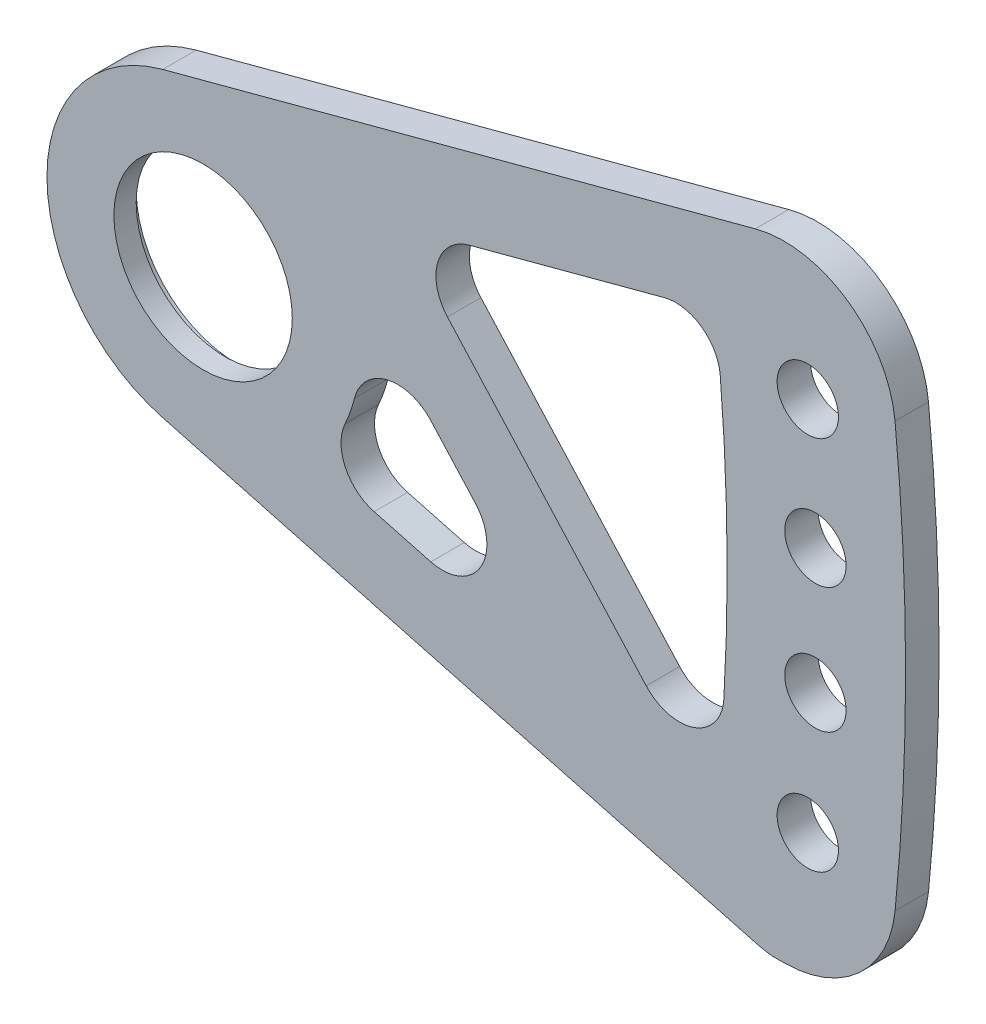
ISO-10303-21;
HEADER;
FILE_DESCRIPTION(('STEP AP214'),'2;1');
FILE_NAME('part.step','',(''),(''),'','','');
FILE_SCHEMA(('AUTOMOTIVE_DESIGN { 1 0 10303 214 1 1 1 1 }'));
ENDSEC;
DATA;
#1=APPLICATION_CONTEXT('core data for automotive mechanical design processes');
#2=APPLICATION_PROTOCOL_DEFINITION('international standard','automotive_design',2000,#1);
#3=PRODUCT_CONTEXT('',#1,'mechanical');
#4=PRODUCT('Part','Part','',(#3));
#5=PRODUCT_RELATED_PRODUCT_CATEGORY('part','',(#4));
#6=PRODUCT_DEFINITION_FORMATION('','',#4);
#7=PRODUCT_DEFINITION_CONTEXT('part definition',#1,'design');
#8=PRODUCT_DEFINITION('design','',#6,#7);
#9=PRODUCT_DEFINITION_SHAPE('','',#8);
#10=(LENGTH_UNIT() NAMED_UNIT(*) SI_UNIT(.MILLI.,.METRE.));
#11=(NAMED_UNIT(*) PLANE_ANGLE_UNIT() SI_UNIT($,.RADIAN.));
#12=(NAMED_UNIT(*) SI_UNIT($,.STERADIAN.) SOLID_ANGLE_UNIT());
#13=UNCERTAINTY_MEASURE_WITH_UNIT(LENGTH_MEASURE(1.E-05),#10,'distance_accuracy_value','');
#14=(GEOMETRIC_REPRESENTATION_CONTEXT(3) GLOBAL_UNCERTAINTY_ASSIGNED_CONTEXT((#13)) GLOBAL_UNIT_ASSIGNED_CONTEXT((#10,
#11,#12)) REPRESENTATION_CONTEXT('',''));
#15=CARTESIAN_POINT('',(0.,0.,0.));
#16=DIRECTION('',(0.,0.,1.));
#17=DIRECTION('',(1.,0.,0.));
#18=AXIS2_PLACEMENT_3D('',#15,#16,#17);
#19=CARTESIAN_POINT('',(129.,0.,3.));
#20=DIRECTION('',(0.,0.,-1.));
#21=DIRECTION('',(-1.,0.,0.));
#22=AXIS2_PLACEMENT_3D('',#19,#20,#21);
#23=CYLINDRICAL_SURFACE('',#22,8.00000000000001);
#24=CARTESIAN_POINT('',(129.,0.,3.));
#25=DIRECTION('',(0.,0.,1.));
#26=DIRECTION('',(1.,0.,0.));
#27=AXIS2_PLACEMENT_3D('',#24,#25,#26);
#28=CIRCLE('',#27,8.00000000000001);
#29=CARTESIAN_POINT('',(137.,0.,3.));
#30=VERTEX_POINT('',#29);
#31=EDGE_CURVE('E243',#30,#30,#28,.T.);
#32=ORIENTED_EDGE('',*,*,#31,.T.);
#33=EDGE_LOOP('',(#32));
#34=FACE_BOUND('',#33,.T.);
#35=CARTESIAN_POINT('',(129.,0.,1.));
#36=DIRECTION('',(0.,0.,-1.));
#37=DIRECTION('',(-1.,0.,0.));
#38=AXIS2_PLACEMENT_3D('',#35,#36,#37);
#39=CIRCLE('',#38,8.00000000000001);
#40=CARTESIAN_POINT('',(121.,0.,1.));
#41=VERTEX_POINT('',#40);
#42=EDGE_CURVE('E216',#41,#41,#39,.T.);
#43=ORIENTED_EDGE('',*,*,#42,.T.);
#44=EDGE_LOOP('',(#43));
#45=FACE_BOUND('',#44,.T.);
#46=ADVANCED_FACE('F36',(#34,#45),#23,.F.);
#47=CARTESIAN_POINT('',(129.,0.,3.));
#48=DIRECTION('',(0.,0.,1.));
#49=DIRECTION('',(1.,0.,0.));
#50=AXIS2_PLACEMENT_3D('',#47,#48,#49);
#51=PLANE('',#50);
#52=DIRECTION('',(-0.966145856932783,0.257996478913219,0.));
#53=VECTOR('',#52,1.);
#54=CARTESIAN_POINT('',(162.485080356981,-16.1870308877341,3.));
#55=LINE('',#54,#53);
#56=CARTESIAN_POINT('',(149.421967329904,-12.6986992445898,3.));
#57=VERTEX_POINT('',#56);
#58=CARTESIAN_POINT('',(144.341412562784,-11.3420042575576,3.));
#59=VERTEX_POINT('',#58);
#60=EDGE_CURVE('E362',#57,#59,#55,.T.);
#61=ORIENTED_EDGE('',*,*,#60,.T.);
#62=CARTESIAN_POINT('',(145.373398478437,-7.47742082982649,3.));
#63=DIRECTION('',(0.,0.,1.));
#64=DIRECTION('',(1.,0.,0.));
#65=AXIS2_PLACEMENT_3D('',#62,#63,#64);
#66=CIRCLE('',#65,4.);
#67=CARTESIAN_POINT('',(141.734865483229,-5.81577175653172,3.));
#68=VERTEX_POINT('',#67);
#69=EDGE_CURVE('E321',#59,#68,#66,.F.);
#70=ORIENTED_EDGE('',*,*,#69,.T.);
#71=CARTESIAN_POINT('',(129.,0.,3.));
#72=DIRECTION('',(0.,0.,1.));
#73=DIRECTION('',(-1.,0.,0.));
#74=AXIS2_PLACEMENT_3D('',#71,#72,#73);
#75=CIRCLE('',#74,14.);
#76=CARTESIAN_POINT('',(142.574461210024,-3.42549308239768,3.));
#77=VERTEX_POINT('',#76);
#78=EDGE_CURVE('E449',#68,#77,#75,.T.);
#79=ORIENTED_EDGE('',*,*,#78,.T.);
#80=CARTESIAN_POINT('',(146.452878698602,-4.40420539165416,3.));
#81=DIRECTION('',(0.,0.,1.));
#82=DIRECTION('',(1.,0.,0.));
#83=AXIS2_PLACEMENT_3D('',#80,#81,#82);
#84=CIRCLE('',#83,4.);
#85=CARTESIAN_POINT('',(149.421334223692,-1.72311013121173,3.));
#86=VERTEX_POINT('',#85);
#87=EDGE_CURVE('E317',#77,#86,#84,.F.);
#88=ORIENTED_EDGE('',*,*,#87,.T.);
#89=DIRECTION('',(0.670273815110609,-0.742113881272322,0.));
#90=VECTOR('',#89,1.);
#91=CARTESIAN_POINT('',(139.389594337812,9.38383341154853,3.));
#92=LINE('',#91,#90);
#93=CARTESIAN_POINT('',(153.422408770646,-6.15302055641629,3.));
#94=VERTEX_POINT('',#93);
#95=EDGE_CURVE('E442',#86,#94,#92,.T.);
#96=ORIENTED_EDGE('',*,*,#95,.T.);
#97=CARTESIAN_POINT('',(150.453953245557,-8.83411581685871,3.));
#98=DIRECTION('',(0.,0.,1.));
#99=DIRECTION('',(1.,0.,0.));
#100=AXIS2_PLACEMENT_3D('',#97,#98,#99);
#101=CIRCLE('',#100,4.);
#102=EDGE_CURVE('E325',#94,#57,#101,.F.);
#103=ORIENTED_EDGE('',*,*,#102,.T.);
#104=EDGE_LOOP('',(#61,#70,#79,#88,#96,#103));
#105=FACE_BOUND('',#104,.T.);
#106=DIRECTION('',(0.966145856932783,0.257996478913219,0.));
#107=VECTOR('',#106,1.);
#108=CARTESIAN_POINT('',(174.915688268969,19.5064604014363,3.));
#109=LINE('',#108,#107);
#110=CARTESIAN_POINT('',(152.849870212736,13.6140753935234,3.));
#111=VERTEX_POINT('',#110);
#112=CARTESIAN_POINT('',(170.361987818592,18.2904548948219,3.));
#113=VERTEX_POINT('',#112);
#114=EDGE_CURVE('E209',#111,#113,#109,.T.);
#115=ORIENTED_EDGE('',*,*,#114,.T.);
#116=CARTESIAN_POINT('',(171.393973734245,14.4258714670908,3.));
#117=DIRECTION('',(0.,0.,1.));
#118=DIRECTION('',(1.,0.,0.));
#119=AXIS2_PLACEMENT_3D('',#116,#117,#118);
#120=CIRCLE('',#119,4.);
#121=CARTESIAN_POINT('',(175.379880100157,14.7613568500464,3.));
#122=VERTEX_POINT('',#121);
#123=EDGE_CURVE('E11',#113,#122,#120,.F.);
#124=ORIENTED_EDGE('',*,*,#123,.T.);
#125=CARTESIAN_POINT('',(0.,0.,3.));
#126=DIRECTION('',(0.,0.,-1.));
#127=DIRECTION('',(-1.,0.,0.));
#128=AXIS2_PLACEMENT_3D('',#125,#126,#127);
#129=CIRCLE('',#128,176.);
#130=CARTESIAN_POINT('',(175.702937473933,-10.2214364465581,3.));
#131=VERTEX_POINT('',#130);
#132=EDGE_CURVE('E349',#122,#131,#129,.T.);
#133=ORIENTED_EDGE('',*,*,#132,.T.);
#134=CARTESIAN_POINT('',(171.70968889498,-9.98913107277269,3.));
#135=DIRECTION('',(0.,0.,1.));
#136=DIRECTION('',(1.,0.,0.));
#137=AXIS2_PLACEMENT_3D('',#134,#135,#136);
#138=CIRCLE('',#137,4.);
#139=CARTESIAN_POINT('',(168.741233369891,-12.6702263332151,3.));
#140=VERTEX_POINT('',#139);
#141=EDGE_CURVE('E333',#131,#140,#138,.F.);
#142=ORIENTED_EDGE('',*,*,#141,.T.);
#143=DIRECTION('',(-0.670273815110608,0.742113881272322,0.));
#144=VECTOR('',#143,1.);
#145=CARTESIAN_POINT('',(174.915688268969,-19.5064604014363,3.));
#146=LINE('',#145,#144);
#147=CARTESIAN_POINT('',(150.9134006033,7.06839670534984,3.));
#148=VERTEX_POINT('',#147);
#149=EDGE_CURVE('E353',#140,#148,#146,.T.);
#150=ORIENTED_EDGE('',*,*,#149,.T.);
#151=CARTESIAN_POINT('',(153.881856128389,9.74949196579227,3.));
#152=DIRECTION('',(0.,0.,1.));
#153=DIRECTION('',(1.,0.,0.));
#154=AXIS2_PLACEMENT_3D('',#151,#152,#153);
#155=CIRCLE('',#154,4.);
#156=EDGE_CURVE('E329',#148,#111,#155,.F.);
#157=ORIENTED_EDGE('',*,*,#156,.T.);
#158=EDGE_LOOP('',(#115,#124,#133,#142,#150,#157));
#159=FACE_BOUND('',#158,.T.);
#160=CARTESIAN_POINT('',(129.,0.,3.));
#161=DIRECTION('',(0.,0.,1.));
#162=DIRECTION('',(1.,0.,0.));
#163=AXIS2_PLACEMENT_3D('',#160,#161,#162);
#164=CIRCLE('',#163,14.);
#165=CARTESIAN_POINT('',(125.388049295215,13.526041997059,3.));
#166=VERTEX_POINT('',#165);
#167=CARTESIAN_POINT('',(125.388049295215,-13.526041997059,3.));
#168=VERTEX_POINT('',#167);
#169=EDGE_CURVE('E173',#166,#168,#164,.T.);
#170=ORIENTED_EDGE('',*,*,#169,.T.);
#171=DIRECTION('',(0.966145856932783,-0.257996478913219,0.));
#172=VECTOR('',#171,1.);
#173=CARTESIAN_POINT('',(178.522421186668,-27.7148735889893,3.));
#174=LINE('',#173,#172);
#175=CARTESIAN_POINT('',(178.522421186668,-27.7148735889893,3.));
#176=VERTEX_POINT('',#175);
#177=EDGE_CURVE('E179',#168,#176,#174,.T.);
#178=ORIENTED_EDGE('',*,*,#177,.T.);
#179=CARTESIAN_POINT('',(181.102385975801,-18.0534150196615,3.));
#180=DIRECTION('',(0.,0.,1.));
#181=DIRECTION('',(1.,0.,0.));
#182=AXIS2_PLACEMENT_3D('',#179,#180,#181);
#183=CIRCLE('',#182,10.);
#184=CARTESIAN_POINT('',(180.070180943404,-28.,3.));
#185=VERTEX_POINT('',#184);
#186=EDGE_CURVE('E196',#176,#185,#183,.T.);
#187=ORIENTED_EDGE('',*,*,#186,.T.);
#188=DIRECTION('',(1.,0.,0.));
#189=VECTOR('',#188,1.);
#190=CARTESIAN_POINT('',(-1.39871775245393,-28.,3.));
#191=LINE('',#190,#189);
#192=CARTESIAN_POINT('',(181.107702762748,-28.,3.));
#193=VERTEX_POINT('',#192);
#194=EDGE_CURVE('E247',#185,#193,#191,.T.);
#195=ORIENTED_EDGE('',*,*,#194,.T.);
#196=CARTESIAN_POINT('',(181.107702762748,-18.,3.));
#197=DIRECTION('',(0.,0.,1.));
#198=DIRECTION('',(1.,0.,0.));
#199=AXIS2_PLACEMENT_3D('',#196,#197,#198);
#200=CIRCLE('',#199,10.);
#201=CARTESIAN_POINT('',(191.05867544202,-18.989010989011,3.));
#202=VERTEX_POINT('',#201);
#203=EDGE_CURVE('E276',#193,#202,#200,.T.);
#204=ORIENTED_EDGE('',*,*,#203,.T.);
#205=CARTESIAN_POINT('',(0.,0.,3.));
#206=DIRECTION('',(0.,0.,1.));
#207=DIRECTION('',(1.,0.,0.));
#208=AXIS2_PLACEMENT_3D('',#205,#206,#207);
#209=CIRCLE('',#208,192.);
#210=CARTESIAN_POINT('',(191.053066523922,19.0453608998627,3.));
#211=VERTEX_POINT('',#210);
#212=EDGE_CURVE('E249',#202,#211,#209,.T.);
#213=ORIENTED_EDGE('',*,*,#212,.T.);
#214=CARTESIAN_POINT('',(181.102385975801,18.0534150196615,3.));
#215=DIRECTION('',(0.,0.,1.));
#216=DIRECTION('',(1.,0.,0.));
#217=AXIS2_PLACEMENT_3D('',#214,#215,#216);
#218=CIRCLE('',#217,10.);
#219=CARTESIAN_POINT('',(178.522421186668,27.7148735889893,3.));
#220=VERTEX_POINT('',#219);
#221=EDGE_CURVE('E274',#211,#220,#218,.T.);
#222=ORIENTED_EDGE('',*,*,#221,.T.);
#223=DIRECTION('',(-0.966145856932783,-0.257996478913219,0.));
#224=VECTOR('',#223,1.);
#225=CARTESIAN_POINT('',(125.388049295215,13.526041997059,3.));
#226=LINE('',#225,#224);
#227=EDGE_CURVE('E181',#220,#166,#226,.T.);
#228=ORIENTED_EDGE('',*,*,#227,.T.);
#229=EDGE_LOOP('',(#170,#178,#187,#195,#204,#213,#222,#228));
#230=FACE_BOUND('',#229,.T.);
#231=CARTESIAN_POINT('',(183.228106673738,16.8362978340661,3.));
#232=DIRECTION('',(0.,0.,1.));
#233=DIRECTION('',(1.,0.,0.));
#234=AXIS2_PLACEMENT_3D('',#231,#232,#233);
#235=CIRCLE('',#234,2.75);
#236=CARTESIAN_POINT('',(185.978106673738,16.8362978340661,3.));
#237=VERTEX_POINT('',#236);
#238=EDGE_CURVE('E219',#237,#237,#235,.T.);
#239=ORIENTED_EDGE('',*,*,#238,.F.);
#240=EDGE_LOOP('',(#239));
#241=FACE_BOUND('',#240,.T.);
#242=CARTESIAN_POINT('',(183.914180713955,5.61908643060739,3.));
#243=DIRECTION('',(0.,0.,1.));
#244=DIRECTION('',(1.,0.,0.));
#245=AXIS2_PLACEMENT_3D('',#242,#243,#244);
#246=CIRCLE('',#245,2.74999999999997);
#247=CARTESIAN_POINT('',(186.664180713955,5.61908643060739,3.));
#248=VERTEX_POINT('',#247);
#249=EDGE_CURVE('E225',#248,#248,#246,.T.);
#250=ORIENTED_EDGE('',*,*,#249,.F.);
#251=EDGE_LOOP('',(#250));
#252=FACE_BOUND('',#251,.T.);
#253=CARTESIAN_POINT('',(183.914180713955,-5.61908643060737,3.));
#254=DIRECTION('',(0.,0.,1.));
#255=DIRECTION('',(1.,0.,0.));
#256=AXIS2_PLACEMENT_3D('',#253,#254,#255);
#257=CIRCLE('',#256,2.75);
#258=CARTESIAN_POINT('',(186.664180713955,-5.61908643060737,3.));
#259=VERTEX_POINT('',#258);
#260=EDGE_CURVE('E231',#259,#259,#257,.T.);
#261=ORIENTED_EDGE('',*,*,#260,.F.);
#262=EDGE_LOOP('',(#261));
#263=FACE_BOUND('',#262,.T.);
#264=CARTESIAN_POINT('',(183.228106673738,-16.8362978340661,3.));
#265=DIRECTION('',(0.,0.,1.));
#266=DIRECTION('',(1.,0.,0.));
#267=AXIS2_PLACEMENT_3D('',#264,#265,#266);
#268=CIRCLE('',#267,2.74999999999997);
#269=CARTESIAN_POINT('',(185.978106673738,-16.8362978340661,3.));
#270=VERTEX_POINT('',#269);
#271=EDGE_CURVE('E237',#270,#270,#268,.T.);
#272=ORIENTED_EDGE('',*,*,#271,.F.);
#273=EDGE_LOOP('',(#272));
#274=FACE_BOUND('',#273,.T.);
#275=ORIENTED_EDGE('',*,*,#31,.F.);
#276=EDGE_LOOP('',(#275));
#277=FACE_BOUND('',#276,.T.);
#278=ADVANCED_FACE('F175',(#105,#159,#230,#241,#252,#263,#274,#277),#51,.T.);
#279=CARTESIAN_POINT('',(129.,0.,0.));
#280=DIRECTION('',(0.,0.,1.));
#281=DIRECTION('',(1.,0.,0.));
#282=AXIS2_PLACEMENT_3D('',#279,#280,#281);
#283=PLANE('',#282);
#284=DIRECTION('',(0.670273815110609,-0.742113881272322,0.));
#285=VECTOR('',#284,1.);
#286=CARTESIAN_POINT('',(139.389594337812,9.38383341154853,0.));
#287=LINE('',#286,#285);
#288=CARTESIAN_POINT('',(149.421334223692,-1.72311013121173,0.));
#289=VERTEX_POINT('',#288);
#290=CARTESIAN_POINT('',(153.422408770646,-6.15302055641629,0.));
#291=VERTEX_POINT('',#290);
#292=EDGE_CURVE('E455',#289,#291,#287,.T.);
#293=ORIENTED_EDGE('',*,*,#292,.F.);
#294=CARTESIAN_POINT('',(146.452878698602,-4.40420539165416,0.));
#295=DIRECTION('',(0.,0.,1.));
#296=DIRECTION('',(1.,0.,0.));
#297=AXIS2_PLACEMENT_3D('',#294,#295,#296);
#298=CIRCLE('',#297,4.);
#299=CARTESIAN_POINT('',(142.574461210024,-3.42549308239768,0.));
#300=VERTEX_POINT('',#299);
#301=EDGE_CURVE('E315',#289,#300,#298,.T.);
#302=ORIENTED_EDGE('',*,*,#301,.T.);
#303=CARTESIAN_POINT('',(129.,0.,0.));
#304=DIRECTION('',(0.,0.,1.));
#305=DIRECTION('',(-1.,0.,0.));
#306=AXIS2_PLACEMENT_3D('',#303,#304,#305);
#307=CIRCLE('',#306,14.);
#308=CARTESIAN_POINT('',(141.734865483229,-5.81577175653172,0.));
#309=VERTEX_POINT('',#308);
#310=EDGE_CURVE('E453',#309,#300,#307,.T.);
#311=ORIENTED_EDGE('',*,*,#310,.F.);
#312=CARTESIAN_POINT('',(145.373398478437,-7.47742082982649,0.));
#313=DIRECTION('',(0.,0.,1.));
#314=DIRECTION('',(1.,0.,0.));
#315=AXIS2_PLACEMENT_3D('',#312,#313,#314);
#316=CIRCLE('',#315,4.);
#317=CARTESIAN_POINT('',(144.341412562784,-11.3420042575576,0.));
#318=VERTEX_POINT('',#317);
#319=EDGE_CURVE('E319',#309,#318,#316,.T.);
#320=ORIENTED_EDGE('',*,*,#319,.T.);
#321=DIRECTION('',(-0.966145856932783,0.257996478913219,0.));
#322=VECTOR('',#321,1.);
#323=CARTESIAN_POINT('',(162.485080356981,-16.1870308877341,0.));
#324=LINE('',#323,#322);
#325=CARTESIAN_POINT('',(149.421967329904,-12.6986992445898,0.));
#326=VERTEX_POINT('',#325);
#327=EDGE_CURVE('E358',#326,#318,#324,.T.);
#328=ORIENTED_EDGE('',*,*,#327,.F.);
#329=CARTESIAN_POINT('',(150.453953245557,-8.83411581685871,0.));
#330=DIRECTION('',(0.,0.,1.));
#331=DIRECTION('',(1.,0.,0.));
#332=AXIS2_PLACEMENT_3D('',#329,#330,#331);
#333=CIRCLE('',#332,4.);
#334=EDGE_CURVE('E323',#326,#291,#333,.T.);
#335=ORIENTED_EDGE('',*,*,#334,.T.);
#336=EDGE_LOOP('',(#293,#302,#311,#320,#328,#335));
#337=FACE_BOUND('',#336,.T.);
#338=DIRECTION('',(-0.670273815110608,0.742113881272322,0.));
#339=VECTOR('',#338,1.);
#340=CARTESIAN_POINT('',(174.915688268969,-19.5064604014363,0.));
#341=LINE('',#340,#339);
#342=CARTESIAN_POINT('',(168.741233369891,-12.6702263332151,0.));
#343=VERTEX_POINT('',#342);
#344=CARTESIAN_POINT('',(150.9134006033,7.06839670534984,0.));
#345=VERTEX_POINT('',#344);
#346=EDGE_CURVE('E350',#343,#345,#341,.T.);
#347=ORIENTED_EDGE('',*,*,#346,.F.);
#348=CARTESIAN_POINT('',(171.70968889498,-9.98913107277269,0.));
#349=DIRECTION('',(0.,0.,1.));
#350=DIRECTION('',(1.,0.,0.));
#351=AXIS2_PLACEMENT_3D('',#348,#349,#350);
#352=CIRCLE('',#351,4.);
#353=CARTESIAN_POINT('',(175.702937473933,-10.2214364465581,0.));
#354=VERTEX_POINT('',#353);
#355=EDGE_CURVE('E331',#343,#354,#352,.T.);
#356=ORIENTED_EDGE('',*,*,#355,.T.);
#357=CARTESIAN_POINT('',(0.,0.,0.));
#358=DIRECTION('',(0.,0.,-1.));
#359=DIRECTION('',(-1.,0.,0.));
#360=AXIS2_PLACEMENT_3D('',#357,#358,#359);
#361=CIRCLE('',#360,176.);
#362=CARTESIAN_POINT('',(175.379880100157,14.7613568500464,0.));
#363=VERTEX_POINT('',#362);
#364=EDGE_CURVE('E341',#363,#354,#361,.T.);
#365=ORIENTED_EDGE('',*,*,#364,.F.);
#366=CARTESIAN_POINT('',(171.393973734245,14.4258714670908,0.));
#367=DIRECTION('',(0.,0.,1.));
#368=DIRECTION('',(1.,0.,0.));
#369=AXIS2_PLACEMENT_3D('',#366,#367,#368);
#370=CIRCLE('',#369,4.);
#371=CARTESIAN_POINT('',(170.361987818592,18.2904548948219,0.));
#372=VERTEX_POINT('',#371);
#373=EDGE_CURVE('E44',#363,#372,#370,.T.);
#374=ORIENTED_EDGE('',*,*,#373,.T.);
#375=DIRECTION('',(0.966145856932783,0.257996478913219,0.));
#376=VECTOR('',#375,1.);
#377=CARTESIAN_POINT('',(174.915688268969,19.5064604014363,0.));
#378=LINE('',#377,#376);
#379=CARTESIAN_POINT('',(152.849870212736,13.6140753935234,0.));
#380=VERTEX_POINT('',#379);
#381=EDGE_CURVE('E206',#380,#372,#378,.T.);
#382=ORIENTED_EDGE('',*,*,#381,.F.);
#383=CARTESIAN_POINT('',(153.881856128389,9.74949196579227,0.));
#384=DIRECTION('',(0.,0.,1.));
#385=DIRECTION('',(1.,0.,0.));
#386=AXIS2_PLACEMENT_3D('',#383,#384,#385);
#387=CIRCLE('',#386,4.);
#388=EDGE_CURVE('E327',#380,#345,#387,.T.);
#389=ORIENTED_EDGE('',*,*,#388,.T.);
#390=EDGE_LOOP('',(#347,#356,#365,#374,#382,#389));
#391=FACE_BOUND('',#390,.T.);
#392=CARTESIAN_POINT('',(129.,0.,0.));
#393=DIRECTION('',(0.,0.,-1.));
#394=DIRECTION('',(-1.,0.,0.));
#395=AXIS2_PLACEMENT_3D('',#392,#393,#394);
#396=CIRCLE('',#395,9.);
#397=CARTESIAN_POINT('',(120.,0.,0.));
#398=VERTEX_POINT('',#397);
#399=EDGE_CURVE('E211',#398,#398,#396,.T.);
#400=ORIENTED_EDGE('',*,*,#399,.F.);
#401=EDGE_LOOP('',(#400));
#402=FACE_BOUND('',#401,.T.);
#403=CARTESIAN_POINT('',(183.228106673738,16.8362978340661,0.));
#404=DIRECTION('',(0.,0.,1.));
#405=DIRECTION('',(1.,0.,0.));
#406=AXIS2_PLACEMENT_3D('',#403,#404,#405);
#407=CIRCLE('',#406,2.75);
#408=CARTESIAN_POINT('',(185.978106673738,16.8362978340661,0.));
#409=VERTEX_POINT('',#408);
#410=EDGE_CURVE('E222',#409,#409,#407,.T.);
#411=ORIENTED_EDGE('',*,*,#410,.T.);
#412=EDGE_LOOP('',(#411));
#413=FACE_BOUND('',#412,.T.);
#414=CARTESIAN_POINT('',(183.914180713955,5.61908643060739,0.));
#415=DIRECTION('',(0.,0.,1.));
#416=DIRECTION('',(1.,0.,0.));
#417=AXIS2_PLACEMENT_3D('',#414,#415,#416);
#418=CIRCLE('',#417,2.75);
#419=CARTESIAN_POINT('',(186.664180713955,5.61908643060739,0.));
#420=VERTEX_POINT('',#419);
#421=EDGE_CURVE('E228',#420,#420,#418,.T.);
#422=ORIENTED_EDGE('',*,*,#421,.T.);
#423=EDGE_LOOP('',(#422));
#424=FACE_BOUND('',#423,.T.);
#425=CARTESIAN_POINT('',(183.914180713955,-5.61908643060737,0.));
#426=DIRECTION('',(0.,0.,1.));
#427=DIRECTION('',(1.,0.,0.));
#428=AXIS2_PLACEMENT_3D('',#425,#426,#427);
#429=CIRCLE('',#428,2.75);
#430=CARTESIAN_POINT('',(186.664180713955,-5.61908643060737,0.));
#431=VERTEX_POINT('',#430);
#432=EDGE_CURVE('E234',#431,#431,#429,.T.);
#433=ORIENTED_EDGE('',*,*,#432,.T.);
#434=EDGE_LOOP('',(#433));
#435=FACE_BOUND('',#434,.T.);
#436=CARTESIAN_POINT('',(183.228106673738,-16.8362978340661,0.));
#437=DIRECTION('',(0.,0.,1.));
#438=DIRECTION('',(1.,0.,0.));
#439=AXIS2_PLACEMENT_3D('',#436,#437,#438);
#440=CIRCLE('',#439,2.75);
#441=CARTESIAN_POINT('',(185.978106673738,-16.8362978340661,0.));
#442=VERTEX_POINT('',#441);
#443=EDGE_CURVE('E240',#442,#442,#440,.T.);
#444=ORIENTED_EDGE('',*,*,#443,.T.);
#445=EDGE_LOOP('',(#444));
#446=FACE_BOUND('',#445,.T.);
#447=DIRECTION('',(0.966145856932783,-0.257996478913219,0.));
#448=VECTOR('',#447,1.);
#449=CARTESIAN_POINT('',(178.522421186668,-27.7148735889893,0.));
#450=LINE('',#449,#448);
#451=CARTESIAN_POINT('',(125.388049295215,-13.526041997059,0.));
#452=VERTEX_POINT('',#451);
#453=CARTESIAN_POINT('',(178.522421186668,-27.7148735889893,0.));
#454=VERTEX_POINT('',#453);
#455=EDGE_CURVE('E203',#452,#454,#450,.T.);
#456=ORIENTED_EDGE('',*,*,#455,.F.);
#457=CARTESIAN_POINT('',(129.,0.,0.));
#458=DIRECTION('',(0.,0.,1.));
#459=DIRECTION('',(1.,0.,0.));
#460=AXIS2_PLACEMENT_3D('',#457,#458,#459);
#461=CIRCLE('',#460,14.);
#462=CARTESIAN_POINT('',(125.388049295215,13.526041997059,0.));
#463=VERTEX_POINT('',#462);
#464=EDGE_CURVE('E191',#463,#452,#461,.T.);
#465=ORIENTED_EDGE('',*,*,#464,.F.);
#466=DIRECTION('',(-0.966145856932783,-0.257996478913219,0.));
#467=VECTOR('',#466,1.);
#468=CARTESIAN_POINT('',(125.388049295215,13.526041997059,0.));
#469=LINE('',#468,#467);
#470=CARTESIAN_POINT('',(178.522421186668,27.7148735889893,0.));
#471=VERTEX_POINT('',#470);
#472=EDGE_CURVE('E257',#471,#463,#469,.T.);
#473=ORIENTED_EDGE('',*,*,#472,.F.);
#474=CARTESIAN_POINT('',(181.102385975801,18.0534150196615,0.));
#475=DIRECTION('',(0.,0.,1.));
#476=DIRECTION('',(1.,0.,0.));
#477=AXIS2_PLACEMENT_3D('',#474,#475,#476);
#478=CIRCLE('',#477,10.);
#479=CARTESIAN_POINT('',(191.053066523922,19.0453608998627,0.));
#480=VERTEX_POINT('',#479);
#481=EDGE_CURVE('E266',#471,#480,#478,.F.);
#482=ORIENTED_EDGE('',*,*,#481,.T.);
#483=CARTESIAN_POINT('',(0.,0.,0.));
#484=DIRECTION('',(0.,0.,1.));
#485=DIRECTION('',(1.,0.,0.));
#486=AXIS2_PLACEMENT_3D('',#483,#484,#485);
#487=CIRCLE('',#486,192.);
#488=CARTESIAN_POINT('',(191.05867544202,-18.989010989011,0.));
#489=VERTEX_POINT('',#488);
#490=EDGE_CURVE('E254',#489,#480,#487,.T.);
#491=ORIENTED_EDGE('',*,*,#490,.F.);
#492=CARTESIAN_POINT('',(181.107702762748,-18.,0.));
#493=DIRECTION('',(0.,0.,1.));
#494=DIRECTION('',(1.,0.,0.));
#495=AXIS2_PLACEMENT_3D('',#492,#493,#494);
#496=CIRCLE('',#495,10.);
#497=CARTESIAN_POINT('',(181.107702762748,-28.,0.));
#498=VERTEX_POINT('',#497);
#499=EDGE_CURVE('E268',#489,#498,#496,.F.);
#500=ORIENTED_EDGE('',*,*,#499,.T.);
#501=DIRECTION('',(1.,0.,0.));
#502=VECTOR('',#501,1.);
#503=CARTESIAN_POINT('',(-1.39871775245393,-28.,0.));
#504=LINE('',#503,#502);
#505=CARTESIAN_POINT('',(180.070180943404,-28.,0.));
#506=VERTEX_POINT('',#505);
#507=EDGE_CURVE('E246',#506,#498,#504,.T.);
#508=ORIENTED_EDGE('',*,*,#507,.F.);
#509=CARTESIAN_POINT('',(181.102385975801,-18.0534150196615,0.));
#510=DIRECTION('',(0.,0.,1.));
#511=DIRECTION('',(1.,0.,0.));
#512=AXIS2_PLACEMENT_3D('',#509,#510,#511);
#513=CIRCLE('',#512,10.);
#514=EDGE_CURVE('E200',#454,#506,#513,.T.);
#515=ORIENTED_EDGE('',*,*,#514,.F.);
#516=EDGE_LOOP('',(#456,#465,#473,#482,#491,#500,#508,#515));
#517=FACE_BOUND('',#516,.T.);
#518=ADVANCED_FACE('F339',(#337,#391,#402,#413,#424,#435,#446,#517),#283,.F.);
#519=CARTESIAN_POINT('',(-1.39871775245393,-28.,3.));
#520=DIRECTION('',(0.,1.,0.));
#521=DIRECTION('',(0.,0.,1.));
#522=AXIS2_PLACEMENT_3D('',#519,#520,#521);
#523=PLANE('',#522);
#524=ORIENTED_EDGE('',*,*,#194,.F.);
#525=DIRECTION('',(0.,0.,-1.));
#526=VECTOR('',#525,1.);
#527=CARTESIAN_POINT('',(180.070180943404,-28.,3.));
#528=LINE('',#527,#526);
#529=EDGE_CURVE('E281',#185,#506,#528,.T.);
#530=ORIENTED_EDGE('',*,*,#529,.T.);
#531=ORIENTED_EDGE('',*,*,#507,.T.);
#532=DIRECTION('',(0.,0.,-1.));
#533=VECTOR('',#532,1.);
#534=CARTESIAN_POINT('',(181.107702762748,-28.,3.));
#535=LINE('',#534,#533);
#536=EDGE_CURVE('E271',#498,#193,#535,.F.);
#537=ORIENTED_EDGE('',*,*,#536,.T.);
#538=EDGE_LOOP('',(#524,#530,#531,#537));
#539=FACE_BOUND('',#538,.T.);
#540=ADVANCED_FACE('F396',(#539),#523,.F.);
#541=CARTESIAN_POINT('',(0.,0.,3.));
#542=DIRECTION('',(0.,0.,-1.));
#543=DIRECTION('',(-1.,0.,0.));
#544=AXIS2_PLACEMENT_3D('',#541,#542,#543);
#545=CYLINDRICAL_SURFACE('',#544,192.);
#546=ORIENTED_EDGE('',*,*,#212,.F.);
#547=DIRECTION('',(0.,0.,-1.));
#548=VECTOR('',#547,1.);
#549=CARTESIAN_POINT('',(191.05867544202,-18.989010989011,3.));
#550=LINE('',#549,#548);
#551=EDGE_CURVE('E263',#202,#489,#550,.T.);
#552=ORIENTED_EDGE('',*,*,#551,.T.);
#553=ORIENTED_EDGE('',*,*,#490,.T.);
#554=DIRECTION('',(0.,0.,-1.));
#555=VECTOR('',#554,1.);
#556=CARTESIAN_POINT('',(191.053066523922,19.0453608998627,3.));
#557=LINE('',#556,#555);
#558=EDGE_CURVE('E261',#480,#211,#557,.F.);
#559=ORIENTED_EDGE('',*,*,#558,.T.);
#560=EDGE_LOOP('',(#546,#552,#553,#559));
#561=FACE_BOUND('',#560,.T.);
#562=ADVANCED_FACE('F403',(#561),#545,.T.);
#563=CARTESIAN_POINT('',(125.388049295215,13.526041997059,3.));
#564=DIRECTION('',(0.257996478913219,-0.966145856932783,0.));
#565=DIRECTION('',(0.966145856932783,0.257996478913219,0.));
#566=AXIS2_PLACEMENT_3D('',#563,#564,#565);
#567=PLANE('',#566);
#568=ORIENTED_EDGE('',*,*,#227,.F.);
#569=DIRECTION('',(0.,0.,-1.));
#570=VECTOR('',#569,1.);
#571=CARTESIAN_POINT('',(178.522421186668,27.7148735889893,3.));
#572=LINE('',#571,#570);
#573=EDGE_CURVE('E278',#220,#471,#572,.T.);
#574=ORIENTED_EDGE('',*,*,#573,.T.);
#575=ORIENTED_EDGE('',*,*,#472,.T.);
#576=DIRECTION('',(0.,0.,-1.));
#577=VECTOR('',#576,1.);
#578=CARTESIAN_POINT('',(125.388049295215,13.526041997059,3.));
#579=LINE('',#578,#577);
#580=EDGE_CURVE('E185',#166,#463,#579,.T.);
#581=ORIENTED_EDGE('',*,*,#580,.F.);
#582=EDGE_LOOP('',(#568,#574,#575,#581));
#583=FACE_BOUND('',#582,.T.);
#584=ADVANCED_FACE('F400',(#583),#567,.F.);
#585=CARTESIAN_POINT('',(129.,0.,3.));
#586=DIRECTION('',(0.,0.,-1.));
#587=DIRECTION('',(-1.,0.,0.));
#588=AXIS2_PLACEMENT_3D('',#585,#586,#587);
#589=CYLINDRICAL_SURFACE('',#588,14.);
#590=ORIENTED_EDGE('',*,*,#464,.T.);
#591=DIRECTION('',(0.,0.,-1.));
#592=VECTOR('',#591,1.);
#593=CARTESIAN_POINT('',(125.388049295215,-13.526041997059,3.));
#594=LINE('',#593,#592);
#595=EDGE_CURVE('E188',#168,#452,#594,.T.);
#596=ORIENTED_EDGE('',*,*,#595,.F.);
#597=ORIENTED_EDGE('',*,*,#169,.F.);
#598=ORIENTED_EDGE('',*,*,#580,.T.);
#599=EDGE_LOOP('',(#590,#596,#597,#598));
#600=FACE_BOUND('',#599,.T.);
#601=ADVANCED_FACE('F189',(#600),#589,.T.);
#602=CARTESIAN_POINT('',(183.228106673738,-16.8362978340661,3.));
#603=DIRECTION('',(0.,0.,1.));
#604=DIRECTION('',(1.,0.,0.));
#605=AXIS2_PLACEMENT_3D('',#602,#603,#604);
#606=CYLINDRICAL_SURFACE('',#605,2.74999999999999);
#607=ORIENTED_EDGE('',*,*,#443,.F.);
#608=EDGE_LOOP('',(#607));
#609=FACE_BOUND('',#608,.T.);
#610=ORIENTED_EDGE('',*,*,#271,.T.);
#611=EDGE_LOOP('',(#610));
#612=FACE_BOUND('',#611,.T.);
#613=ADVANCED_FACE('F391',(#609,#612),#606,.F.);
#614=CARTESIAN_POINT('',(183.914180713955,-5.61908643060737,3.));
#615=DIRECTION('',(0.,0.,1.));
#616=DIRECTION('',(1.,0.,0.));
#617=AXIS2_PLACEMENT_3D('',#614,#615,#616);
#618=CYLINDRICAL_SURFACE('',#617,2.75);
#619=ORIENTED_EDGE('',*,*,#432,.F.);
#620=EDGE_LOOP('',(#619));
#621=FACE_BOUND('',#620,.T.);
#622=ORIENTED_EDGE('',*,*,#260,.T.);
#623=EDGE_LOOP('',(#622));
#624=FACE_BOUND('',#623,.T.);
#625=ADVANCED_FACE('F500',(#621,#624),#618,.F.);
#626=CARTESIAN_POINT('',(183.914180713955,5.61908643060739,3.));
#627=DIRECTION('',(0.,0.,1.));
#628=DIRECTION('',(1.,0.,0.));
#629=AXIS2_PLACEMENT_3D('',#626,#627,#628);
#630=CYLINDRICAL_SURFACE('',#629,2.74999999999999);
#631=ORIENTED_EDGE('',*,*,#421,.F.);
#632=EDGE_LOOP('',(#631));
#633=FACE_BOUND('',#632,.T.);
#634=ORIENTED_EDGE('',*,*,#249,.T.);
#635=EDGE_LOOP('',(#634));
#636=FACE_BOUND('',#635,.T.);
#637=ADVANCED_FACE('F497',(#633,#636),#630,.F.);
#638=CARTESIAN_POINT('',(183.228106673738,16.8362978340661,3.));
#639=DIRECTION('',(0.,0.,1.));
#640=DIRECTION('',(1.,0.,0.));
#641=AXIS2_PLACEMENT_3D('',#638,#639,#640);
#642=CYLINDRICAL_SURFACE('',#641,2.75);
#643=ORIENTED_EDGE('',*,*,#410,.F.);
#644=EDGE_LOOP('',(#643));
#645=FACE_BOUND('',#644,.T.);
#646=ORIENTED_EDGE('',*,*,#238,.T.);
#647=EDGE_LOOP('',(#646));
#648=FACE_BOUND('',#647,.T.);
#649=ADVANCED_FACE('F415',(#645,#648),#642,.F.);
#650=CARTESIAN_POINT('',(181.107702762748,-18.,3.));
#651=DIRECTION('',(0.,0.,-1.));
#652=DIRECTION('',(-1.,0.,0.));
#653=AXIS2_PLACEMENT_3D('',#650,#651,#652);
#654=CYLINDRICAL_SURFACE('',#653,10.);
#655=ORIENTED_EDGE('',*,*,#203,.F.);
#656=ORIENTED_EDGE('',*,*,#536,.F.);
#657=ORIENTED_EDGE('',*,*,#499,.F.);
#658=ORIENTED_EDGE('',*,*,#551,.F.);
#659=EDGE_LOOP('',(#655,#656,#657,#658));
#660=FACE_BOUND('',#659,.T.);
#661=ADVANCED_FACE('F411',(#660),#654,.T.);
#662=CARTESIAN_POINT('',(181.102385975801,18.0534150196615,3.));
#663=DIRECTION('',(0.,0.,-1.));
#664=DIRECTION('',(-1.,0.,0.));
#665=AXIS2_PLACEMENT_3D('',#662,#663,#664);
#666=CYLINDRICAL_SURFACE('',#665,10.);
#667=ORIENTED_EDGE('',*,*,#221,.F.);
#668=ORIENTED_EDGE('',*,*,#558,.F.);
#669=ORIENTED_EDGE('',*,*,#481,.F.);
#670=ORIENTED_EDGE('',*,*,#573,.F.);
#671=EDGE_LOOP('',(#667,#668,#669,#670));
#672=FACE_BOUND('',#671,.T.);
#673=ADVANCED_FACE('F414',(#672),#666,.T.);
#674=CARTESIAN_POINT('',(129.,0.,1.));
#675=DIRECTION('',(0.,0.,-1.));
#676=DIRECTION('',(-1.,0.,0.));
#677=AXIS2_PLACEMENT_3D('',#674,#675,#676);
#678=CYLINDRICAL_SURFACE('',#677,9.);
#679=CARTESIAN_POINT('',(129.,0.,1.));
#680=DIRECTION('',(0.,0.,-1.));
#681=DIRECTION('',(-1.,0.,0.));
#682=AXIS2_PLACEMENT_3D('',#679,#680,#681);
#683=CIRCLE('',#682,9.);
#684=CARTESIAN_POINT('',(120.,0.,1.));
#685=VERTEX_POINT('',#684);
#686=EDGE_CURVE('E213',#685,#685,#683,.T.);
#687=ORIENTED_EDGE('',*,*,#686,.F.);
#688=EDGE_LOOP('',(#687));
#689=FACE_BOUND('',#688,.T.);
#690=ORIENTED_EDGE('',*,*,#399,.T.);
#691=EDGE_LOOP('',(#690));
#692=FACE_BOUND('',#691,.T.);
#693=ADVANCED_FACE('F419',(#689,#692),#678,.F.);
#694=CARTESIAN_POINT('',(129.,0.,1.));
#695=DIRECTION('',(0.,0.,-1.));
#696=DIRECTION('',(-1.,0.,0.));
#697=AXIS2_PLACEMENT_3D('',#694,#695,#696);
#698=PLANE('',#697);
#699=ORIENTED_EDGE('',*,*,#42,.F.);
#700=EDGE_LOOP('',(#699));
#701=FACE_BOUND('',#700,.T.);
#702=ORIENTED_EDGE('',*,*,#686,.T.);
#703=EDGE_LOOP('',(#702));
#704=FACE_BOUND('',#703,.T.);
#705=ADVANCED_FACE('F485',(#701,#704),#698,.T.);
#706=CARTESIAN_POINT('',(181.102385975801,-18.0534150196615,3.));
#707=DIRECTION('',(0.,0.,-1.));
#708=DIRECTION('',(-1.,0.,0.));
#709=AXIS2_PLACEMENT_3D('',#706,#707,#708);
#710=CYLINDRICAL_SURFACE('',#709,10.);
#711=ORIENTED_EDGE('',*,*,#186,.F.);
#712=DIRECTION('',(0.,0.,-1.));
#713=VECTOR('',#712,1.);
#714=CARTESIAN_POINT('',(178.522421186668,-27.7148735889893,3.));
#715=LINE('',#714,#713);
#716=EDGE_CURVE('E195',#176,#454,#715,.T.);
#717=ORIENTED_EDGE('',*,*,#716,.T.);
#718=ORIENTED_EDGE('',*,*,#514,.T.);
#719=ORIENTED_EDGE('',*,*,#529,.F.);
#720=EDGE_LOOP('',(#711,#717,#718,#719));
#721=FACE_BOUND('',#720,.T.);
#722=ADVANCED_FACE('F482',(#721),#710,.T.);
#723=CARTESIAN_POINT('',(178.522421186668,-27.7148735889893,3.));
#724=DIRECTION('',(0.257996478913219,0.966145856932783,0.));
#725=DIRECTION('',(-0.966145856932783,0.257996478913219,0.));
#726=AXIS2_PLACEMENT_3D('',#723,#724,#725);
#727=PLANE('',#726);
#728=ORIENTED_EDGE('',*,*,#455,.T.);
#729=ORIENTED_EDGE('',*,*,#716,.F.);
#730=ORIENTED_EDGE('',*,*,#177,.F.);
#731=ORIENTED_EDGE('',*,*,#595,.T.);
#732=EDGE_LOOP('',(#728,#729,#730,#731));
#733=FACE_BOUND('',#732,.T.);
#734=ADVANCED_FACE('F198',(#733),#727,.F.);
#735=CARTESIAN_POINT('',(0.,0.,3.));
#736=DIRECTION('',(0.,0.,-1.));
#737=DIRECTION('',(-1.,0.,0.));
#738=AXIS2_PLACEMENT_3D('',#735,#736,#737);
#739=CYLINDRICAL_SURFACE('',#738,176.);
#740=ORIENTED_EDGE('',*,*,#364,.T.);
#741=DIRECTION('',(0.,0.,-1.));
#742=VECTOR('',#741,1.);
#743=CARTESIAN_POINT('',(175.702937473933,-10.2214364465581,3.));
#744=LINE('',#743,#742);
#745=EDGE_CURVE('E51',#354,#131,#744,.F.);
#746=ORIENTED_EDGE('',*,*,#745,.T.);
#747=ORIENTED_EDGE('',*,*,#132,.F.);
#748=DIRECTION('',(0.,0.,-1.));
#749=VECTOR('',#748,1.);
#750=CARTESIAN_POINT('',(175.379880100157,14.7613568500464,3.));
#751=LINE('',#750,#749);
#752=EDGE_CURVE('E311',#122,#363,#751,.T.);
#753=ORIENTED_EDGE('',*,*,#752,.T.);
#754=EDGE_LOOP('',(#740,#746,#747,#753));
#755=FACE_BOUND('',#754,.T.);
#756=ADVANCED_FACE('F351',(#755),#739,.F.);
#757=CARTESIAN_POINT('',(174.915688268969,19.5064604014363,3.));
#758=DIRECTION('',(-0.257996478913219,0.966145856932783,0.));
#759=DIRECTION('',(-0.966145856932783,-0.257996478913219,0.));
#760=AXIS2_PLACEMENT_3D('',#757,#758,#759);
#761=PLANE('',#760);
#762=ORIENTED_EDGE('',*,*,#114,.F.);
#763=DIRECTION('',(0.,0.,-1.));
#764=VECTOR('',#763,1.);
#765=CARTESIAN_POINT('',(152.849870212736,13.6140753935234,0.));
#766=LINE('',#765,#764);
#767=EDGE_CURVE('E303',#111,#380,#766,.T.);
#768=ORIENTED_EDGE('',*,*,#767,.T.);
#769=ORIENTED_EDGE('',*,*,#381,.T.);
#770=DIRECTION('',(0.,0.,1.));
#771=VECTOR('',#770,1.);
#772=CARTESIAN_POINT('',(170.361987818592,18.2904548948219,3.));
#773=LINE('',#772,#771);
#774=EDGE_CURVE('E301',#372,#113,#773,.T.);
#775=ORIENTED_EDGE('',*,*,#774,.T.);
#776=EDGE_LOOP('',(#762,#768,#769,#775));
#777=FACE_BOUND('',#776,.T.);
#778=ADVANCED_FACE('F347',(#777),#761,.F.);
#779=CARTESIAN_POINT('',(174.915688268969,-19.5064604014363,3.));
#780=DIRECTION('',(-0.742113881272322,-0.670273815110608,0.));
#781=DIRECTION('',(0.670273815110608,-0.742113881272322,0.));
#782=AXIS2_PLACEMENT_3D('',#779,#780,#781);
#783=PLANE('',#782);
#784=ORIENTED_EDGE('',*,*,#346,.T.);
#785=DIRECTION('',(0.,0.,-1.));
#786=VECTOR('',#785,1.);
#787=CARTESIAN_POINT('',(150.9134006033,7.06839670534985,3.));
#788=LINE('',#787,#786);
#789=EDGE_CURVE('E309',#345,#148,#788,.F.);
#790=ORIENTED_EDGE('',*,*,#789,.T.);
#791=ORIENTED_EDGE('',*,*,#149,.F.);
#792=DIRECTION('',(0.,0.,1.));
#793=VECTOR('',#792,1.);
#794=CARTESIAN_POINT('',(168.741233369891,-12.6702263332151,0.));
#795=LINE('',#794,#793);
#796=EDGE_CURVE('E306',#140,#343,#795,.F.);
#797=ORIENTED_EDGE('',*,*,#796,.T.);
#798=EDGE_LOOP('',(#784,#790,#791,#797));
#799=FACE_BOUND('',#798,.T.);
#800=ADVANCED_FACE('F366',(#799),#783,.F.);
#801=CARTESIAN_POINT('',(129.,0.,3.));
#802=DIRECTION('',(0.,0.,-1.));
#803=DIRECTION('',(-1.,0.,0.));
#804=AXIS2_PLACEMENT_3D('',#801,#802,#803);
#805=CYLINDRICAL_SURFACE('',#804,14.);
#806=ORIENTED_EDGE('',*,*,#310,.T.);
#807=DIRECTION('',(0.,0.,-1.));
#808=VECTOR('',#807,1.);
#809=CARTESIAN_POINT('',(142.574461210024,-3.42549308239768,3.));
#810=LINE('',#809,#808);
#811=EDGE_CURVE('E294',#300,#77,#810,.F.);
#812=ORIENTED_EDGE('',*,*,#811,.T.);
#813=ORIENTED_EDGE('',*,*,#78,.F.);
#814=DIRECTION('',(0.,0.,-1.));
#815=VECTOR('',#814,1.);
#816=CARTESIAN_POINT('',(141.734865483229,-5.81577175653172,3.));
#817=LINE('',#816,#815);
#818=EDGE_CURVE('E291',#68,#309,#817,.T.);
#819=ORIENTED_EDGE('',*,*,#818,.T.);
#820=EDGE_LOOP('',(#806,#812,#813,#819));
#821=FACE_BOUND('',#820,.T.);
#822=ADVANCED_FACE('F467',(#821),#805,.T.);
#823=CARTESIAN_POINT('',(162.485080356981,-16.1870308877341,3.));
#824=DIRECTION('',(-0.257996478913219,-0.966145856932783,0.));
#825=DIRECTION('',(0.966145856932783,-0.257996478913219,0.));
#826=AXIS2_PLACEMENT_3D('',#823,#824,#825);
#827=PLANE('',#826);
#828=ORIENTED_EDGE('',*,*,#327,.T.);
#829=DIRECTION('',(0.,0.,1.));
#830=VECTOR('',#829,1.);
#831=CARTESIAN_POINT('',(144.341412562784,-11.3420042575576,3.));
#832=LINE('',#831,#830);
#833=EDGE_CURVE('E299',#318,#59,#832,.T.);
#834=ORIENTED_EDGE('',*,*,#833,.T.);
#835=ORIENTED_EDGE('',*,*,#60,.F.);
#836=DIRECTION('',(0.,0.,-1.));
#837=VECTOR('',#836,1.);
#838=CARTESIAN_POINT('',(149.421967329904,-12.6986992445898,0.));
#839=LINE('',#838,#837);
#840=EDGE_CURVE('E296',#57,#326,#839,.T.);
#841=ORIENTED_EDGE('',*,*,#840,.T.);
#842=EDGE_LOOP('',(#828,#834,#835,#841));
#843=FACE_BOUND('',#842,.T.);
#844=ADVANCED_FACE('F445',(#843),#827,.F.);
#845=CARTESIAN_POINT('',(139.389594337812,9.38383341154853,3.));
#846=DIRECTION('',(0.742113881272322,0.670273815110609,0.));
#847=DIRECTION('',(-0.670273815110609,0.742113881272322,0.));
#848=AXIS2_PLACEMENT_3D('',#845,#846,#847);
#849=PLANE('',#848);
#850=ORIENTED_EDGE('',*,*,#95,.F.);
#851=DIRECTION('',(0.,0.,1.));
#852=VECTOR('',#851,1.);
#853=CARTESIAN_POINT('',(149.421334223692,-1.72311013121173,0.));
#854=LINE('',#853,#852);
#855=EDGE_CURVE('E288',#86,#289,#854,.F.);
#856=ORIENTED_EDGE('',*,*,#855,.T.);
#857=ORIENTED_EDGE('',*,*,#292,.T.);
#858=DIRECTION('',(0.,0.,-1.));
#859=VECTOR('',#858,1.);
#860=CARTESIAN_POINT('',(153.422408770646,-6.15302055641628,3.));
#861=LINE('',#860,#859);
#862=EDGE_CURVE('E286',#291,#94,#861,.F.);
#863=ORIENTED_EDGE('',*,*,#862,.T.);
#864=EDGE_LOOP('',(#850,#856,#857,#863));
#865=FACE_BOUND('',#864,.T.);
#866=ADVANCED_FACE('F425',(#865),#849,.F.);
#867=CARTESIAN_POINT('',(146.452878698602,-4.40420539165416,3.));
#868=DIRECTION('',(0.,0.,-1.));
#869=DIRECTION('',(-1.,0.,0.));
#870=AXIS2_PLACEMENT_3D('',#867,#868,#869);
#871=CYLINDRICAL_SURFACE('',#870,4.);
#872=ORIENTED_EDGE('',*,*,#87,.F.);
#873=ORIENTED_EDGE('',*,*,#811,.F.);
#874=ORIENTED_EDGE('',*,*,#301,.F.);
#875=ORIENTED_EDGE('',*,*,#855,.F.);
#876=EDGE_LOOP('',(#872,#873,#874,#875));
#877=FACE_BOUND('',#876,.T.);
#878=ADVANCED_FACE('F421',(#877),#871,.F.);
#879=CARTESIAN_POINT('',(145.373398478437,-7.47742082982649,3.));
#880=DIRECTION('',(0.,0.,-1.));
#881=DIRECTION('',(-1.,0.,0.));
#882=AXIS2_PLACEMENT_3D('',#879,#880,#881);
#883=CYLINDRICAL_SURFACE('',#882,4.);
#884=ORIENTED_EDGE('',*,*,#69,.F.);
#885=ORIENTED_EDGE('',*,*,#833,.F.);
#886=ORIENTED_EDGE('',*,*,#319,.F.);
#887=ORIENTED_EDGE('',*,*,#818,.F.);
#888=EDGE_LOOP('',(#884,#885,#886,#887));
#889=FACE_BOUND('',#888,.T.);
#890=ADVANCED_FACE('F424',(#889),#883,.F.);
#891=CARTESIAN_POINT('',(150.453953245557,-8.83411581685871,3.));
#892=DIRECTION('',(0.,0.,1.));
#893=DIRECTION('',(1.,0.,0.));
#894=AXIS2_PLACEMENT_3D('',#891,#892,#893);
#895=CYLINDRICAL_SURFACE('',#894,4.);
#896=ORIENTED_EDGE('',*,*,#102,.F.);
#897=ORIENTED_EDGE('',*,*,#862,.F.);
#898=ORIENTED_EDGE('',*,*,#334,.F.);
#899=ORIENTED_EDGE('',*,*,#840,.F.);
#900=EDGE_LOOP('',(#896,#897,#898,#899));
#901=FACE_BOUND('',#900,.T.);
#902=ADVANCED_FACE('F379',(#901),#895,.F.);
#903=CARTESIAN_POINT('',(153.881856128389,9.74949196579227,3.));
#904=DIRECTION('',(0.,0.,1.));
#905=DIRECTION('',(1.,0.,0.));
#906=AXIS2_PLACEMENT_3D('',#903,#904,#905);
#907=CYLINDRICAL_SURFACE('',#906,4.);
#908=ORIENTED_EDGE('',*,*,#156,.F.);
#909=ORIENTED_EDGE('',*,*,#789,.F.);
#910=ORIENTED_EDGE('',*,*,#388,.F.);
#911=ORIENTED_EDGE('',*,*,#767,.F.);
#912=EDGE_LOOP('',(#908,#909,#910,#911));
#913=FACE_BOUND('',#912,.T.);
#914=ADVANCED_FACE('F371',(#913),#907,.F.);
#915=CARTESIAN_POINT('',(171.70968889498,-9.98913107277269,3.));
#916=DIRECTION('',(0.,0.,-1.));
#917=DIRECTION('',(-1.,0.,0.));
#918=AXIS2_PLACEMENT_3D('',#915,#916,#917);
#919=CYLINDRICAL_SURFACE('',#918,4.);
#920=ORIENTED_EDGE('',*,*,#141,.F.);
#921=ORIENTED_EDGE('',*,*,#745,.F.);
#922=ORIENTED_EDGE('',*,*,#355,.F.);
#923=ORIENTED_EDGE('',*,*,#796,.F.);
#924=EDGE_LOOP('',(#920,#921,#922,#923));
#925=FACE_BOUND('',#924,.T.);
#926=ADVANCED_FACE('F373',(#925),#919,.F.);
#927=CARTESIAN_POINT('',(171.393973734245,14.4258714670908,3.));
#928=DIRECTION('',(0.,0.,-1.));
#929=DIRECTION('',(-1.,0.,0.));
#930=AXIS2_PLACEMENT_3D('',#927,#928,#929);
#931=CYLINDRICAL_SURFACE('',#930,4.);
#932=ORIENTED_EDGE('',*,*,#123,.F.);
#933=ORIENTED_EDGE('',*,*,#774,.F.);
#934=ORIENTED_EDGE('',*,*,#373,.F.);
#935=ORIENTED_EDGE('',*,*,#752,.F.);
#936=EDGE_LOOP('',(#932,#933,#934,#935));
#937=FACE_BOUND('',#936,.T.);
#938=ADVANCED_FACE('F38',(#937),#931,.F.);
#939=CLOSED_SHELL('',(#46,#278,#518,#540,#562,#584,#601,#613,#625,#637,#649,#661,#673,#693,#705,
#722,#734,#756,#778,#800,#822,#844,#866,#878,#890,#902,#914,#926,#938));
#940=MANIFOLD_SOLID_BREP('B2',#939);
#941=ADVANCED_BREP_SHAPE_REPRESENTATION('',(#18,#940),#14);
#942=SHAPE_DEFINITION_REPRESENTATION(#9,#941);
ENDSEC;
END-ISO-10303-21;
